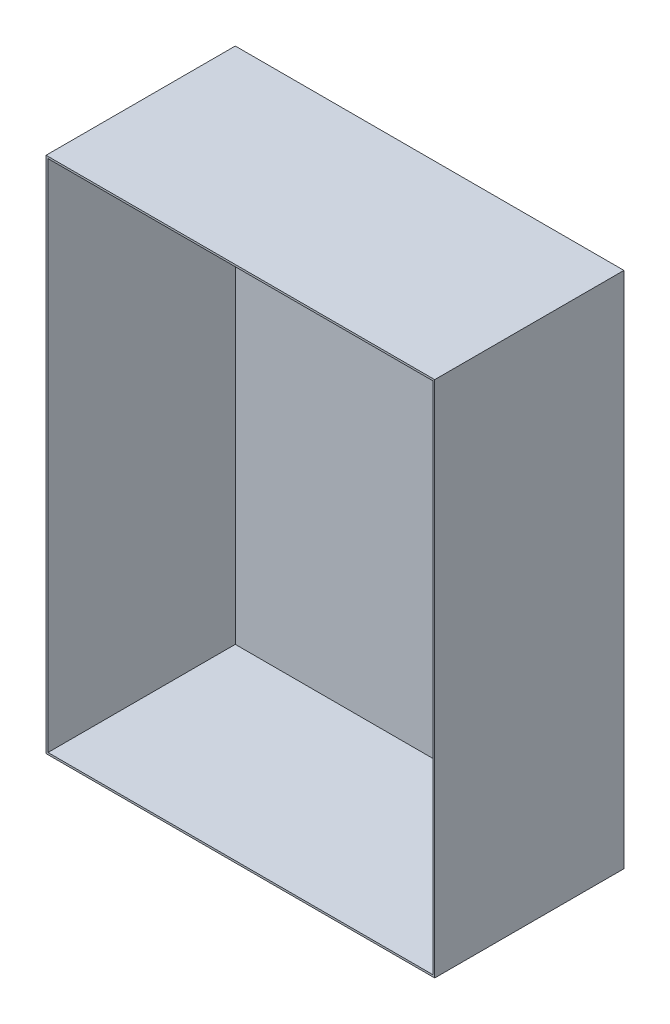
ISO-10303-21;
HEADER;
FILE_DESCRIPTION(('STEP AP214'),'2;1');
FILE_NAME('part.step','',(''),(''),'','','');
FILE_SCHEMA(('AUTOMOTIVE_DESIGN { 1 0 10303 214 1 1 1 1 }'));
ENDSEC;
DATA;
#1=APPLICATION_CONTEXT('core data for automotive mechanical design processes');
#2=APPLICATION_PROTOCOL_DEFINITION('international standard','automotive_design',2000,#1);
#3=PRODUCT_CONTEXT('',#1,'mechanical');
#4=PRODUCT('Part','Part','',(#3));
#5=PRODUCT_RELATED_PRODUCT_CATEGORY('part','',(#4));
#6=PRODUCT_DEFINITION_FORMATION('','',#4);
#7=PRODUCT_DEFINITION_CONTEXT('part definition',#1,'design');
#8=PRODUCT_DEFINITION('design','',#6,#7);
#9=PRODUCT_DEFINITION_SHAPE('','',#8);
#10=(LENGTH_UNIT() NAMED_UNIT(*) SI_UNIT(.MILLI.,.METRE.));
#11=(NAMED_UNIT(*) PLANE_ANGLE_UNIT() SI_UNIT($,.RADIAN.));
#12=(NAMED_UNIT(*) SI_UNIT($,.STERADIAN.) SOLID_ANGLE_UNIT());
#13=UNCERTAINTY_MEASURE_WITH_UNIT(LENGTH_MEASURE(1.E-05),#10,'distance_accuracy_value','');
#14=(GEOMETRIC_REPRESENTATION_CONTEXT(3) GLOBAL_UNCERTAINTY_ASSIGNED_CONTEXT((#13)) GLOBAL_UNIT_ASSIGNED_CONTEXT((#10,
#11,#12)) REPRESENTATION_CONTEXT('',''));
#15=CARTESIAN_POINT('',(0.,0.,0.));
#16=DIRECTION('',(0.,0.,1.));
#17=DIRECTION('',(1.,0.,0.));
#18=AXIS2_PLACEMENT_3D('',#15,#16,#17);
#19=CARTESIAN_POINT('',(0.,0.,146.05));
#20=DIRECTION('',(0.,0.,-1.));
#21=DIRECTION('',(-1.,0.,0.));
#22=AXIS2_PLACEMENT_3D('',#19,#20,#21);
#23=PLANE('',#22);
#24=DIRECTION('',(0.,1.,0.));
#25=VECTOR('',#24,1.);
#26=CARTESIAN_POINT('',(150.,-200.,146.05));
#27=LINE('',#26,#25);
#28=CARTESIAN_POINT('',(150.,-200.,146.05));
#29=VERTEX_POINT('',#28);
#30=CARTESIAN_POINT('',(150.,200.,146.05));
#31=VERTEX_POINT('',#30);
#32=EDGE_CURVE('E146',#29,#31,#27,.T.);
#33=ORIENTED_EDGE('',*,*,#32,.T.);
#34=DIRECTION('',(-1.,0.,0.));
#35=VECTOR('',#34,1.);
#36=CARTESIAN_POINT('',(-150.,200.,146.05));
#37=LINE('',#36,#35);
#38=CARTESIAN_POINT('',(-150.,200.,146.05));
#39=VERTEX_POINT('',#38);
#40=EDGE_CURVE('E90',#31,#39,#37,.T.);
#41=ORIENTED_EDGE('',*,*,#40,.T.);
#42=DIRECTION('',(0.,-1.,0.));
#43=VECTOR('',#42,1.);
#44=CARTESIAN_POINT('',(-150.,-200.,146.05));
#45=LINE('',#44,#43);
#46=CARTESIAN_POINT('',(-150.,-200.,146.05));
#47=VERTEX_POINT('',#46);
#48=EDGE_CURVE('E149',#39,#47,#45,.T.);
#49=ORIENTED_EDGE('',*,*,#48,.T.);
#50=DIRECTION('',(1.,0.,0.));
#51=VECTOR('',#50,1.);
#52=CARTESIAN_POINT('',(-150.,-200.,146.05));
#53=LINE('',#52,#51);
#54=EDGE_CURVE('E62',#47,#29,#53,.T.);
#55=ORIENTED_EDGE('',*,*,#54,.T.);
#56=EDGE_LOOP('',(#33,#41,#49,#55));
#57=FACE_BOUND('',#56,.T.);
#58=DIRECTION('',(0.,1.,0.));
#59=VECTOR('',#58,1.);
#60=CARTESIAN_POINT('',(148.499999952,0.,146.05));
#61=LINE('',#60,#59);
#62=CARTESIAN_POINT('',(148.499999952,-198.499999952,146.05));
#63=VERTEX_POINT('',#62);
#64=CARTESIAN_POINT('',(148.499999952,198.499999952,146.05));
#65=VERTEX_POINT('',#64);
#66=EDGE_CURVE('E135',#63,#65,#61,.T.);
#67=ORIENTED_EDGE('',*,*,#66,.F.);
#68=DIRECTION('',(1.,0.,0.));
#69=VECTOR('',#68,1.);
#70=CARTESIAN_POINT('',(0.,-198.499999952,146.05));
#71=LINE('',#70,#69);
#72=CARTESIAN_POINT('',(-148.499999952,-198.499999952,146.05));
#73=VERTEX_POINT('',#72);
#74=EDGE_CURVE('E144',#73,#63,#71,.T.);
#75=ORIENTED_EDGE('',*,*,#74,.F.);
#76=DIRECTION('',(0.,-1.,0.));
#77=VECTOR('',#76,1.);
#78=CARTESIAN_POINT('',(-148.499999952,0.,146.05));
#79=LINE('',#78,#77);
#80=CARTESIAN_POINT('',(-148.499999952,198.499999952,146.05));
#81=VERTEX_POINT('',#80);
#82=EDGE_CURVE('E142',#81,#73,#79,.T.);
#83=ORIENTED_EDGE('',*,*,#82,.F.);
#84=DIRECTION('',(-1.,0.,0.));
#85=VECTOR('',#84,1.);
#86=CARTESIAN_POINT('',(0.,198.499999952,146.05));
#87=LINE('',#86,#85);
#88=EDGE_CURVE('E127',#65,#81,#87,.T.);
#89=ORIENTED_EDGE('',*,*,#88,.F.);
#90=EDGE_LOOP('',(#67,#75,#83,#89));
#91=FACE_BOUND('',#90,.T.);
#92=ADVANCED_FACE('F38',(#57,#91),#23,.F.);
#93=CARTESIAN_POINT('',(150.,-200.,146.05));
#94=DIRECTION('',(-1.,0.,0.));
#95=DIRECTION('',(0.,0.,1.));
#96=AXIS2_PLACEMENT_3D('',#93,#94,#95);
#97=PLANE('',#96);
#98=DIRECTION('',(0.,1.,0.));
#99=VECTOR('',#98,1.);
#100=CARTESIAN_POINT('',(150.,-200.,0.));
#101=LINE('',#100,#99);
#102=CARTESIAN_POINT('',(150.,-200.,0.));
#103=VERTEX_POINT('',#102);
#104=CARTESIAN_POINT('',(150.,200.,0.));
#105=VERTEX_POINT('',#104);
#106=EDGE_CURVE('E153',#103,#105,#101,.T.);
#107=ORIENTED_EDGE('',*,*,#106,.T.);
#108=DIRECTION('',(0.,0.,-1.));
#109=VECTOR('',#108,1.);
#110=CARTESIAN_POINT('',(150.,200.,146.05));
#111=LINE('',#110,#109);
#112=EDGE_CURVE('E11',#31,#105,#111,.T.);
#113=ORIENTED_EDGE('',*,*,#112,.F.);
#114=ORIENTED_EDGE('',*,*,#32,.F.);
#115=DIRECTION('',(0.,0.,-1.));
#116=VECTOR('',#115,1.);
#117=CARTESIAN_POINT('',(150.,-200.,146.05));
#118=LINE('',#117,#116);
#119=EDGE_CURVE('E152',#29,#103,#118,.T.);
#120=ORIENTED_EDGE('',*,*,#119,.T.);
#121=EDGE_LOOP('',(#107,#113,#114,#120));
#122=FACE_BOUND('',#121,.T.);
#123=ADVANCED_FACE('F40',(#122),#97,.F.);
#124=CARTESIAN_POINT('',(-150.,200.,146.05));
#125=DIRECTION('',(0.,-1.,0.));
#126=DIRECTION('',(0.,0.,-1.));
#127=AXIS2_PLACEMENT_3D('',#124,#125,#126);
#128=PLANE('',#127);
#129=DIRECTION('',(-1.,0.,0.));
#130=VECTOR('',#129,1.);
#131=CARTESIAN_POINT('',(-150.,200.,0.));
#132=LINE('',#131,#130);
#133=CARTESIAN_POINT('',(-150.,200.,0.));
#134=VERTEX_POINT('',#133);
#135=EDGE_CURVE('E156',#105,#134,#132,.T.);
#136=ORIENTED_EDGE('',*,*,#135,.T.);
#137=DIRECTION('',(0.,0.,-1.));
#138=VECTOR('',#137,1.);
#139=CARTESIAN_POINT('',(-150.,200.,146.05));
#140=LINE('',#139,#138);
#141=EDGE_CURVE('E46',#39,#134,#140,.T.);
#142=ORIENTED_EDGE('',*,*,#141,.F.);
#143=ORIENTED_EDGE('',*,*,#40,.F.);
#144=ORIENTED_EDGE('',*,*,#112,.T.);
#145=EDGE_LOOP('',(#136,#142,#143,#144));
#146=FACE_BOUND('',#145,.T.);
#147=ADVANCED_FACE('F184',(#146),#128,.F.);
#148=CARTESIAN_POINT('',(-150.,-200.,146.05));
#149=DIRECTION('',(1.,0.,0.));
#150=DIRECTION('',(0.,0.,-1.));
#151=AXIS2_PLACEMENT_3D('',#148,#149,#150);
#152=PLANE('',#151);
#153=DIRECTION('',(0.,-1.,0.));
#154=VECTOR('',#153,1.);
#155=CARTESIAN_POINT('',(-150.,-200.,0.));
#156=LINE('',#155,#154);
#157=CARTESIAN_POINT('',(-150.,-200.,0.));
#158=VERTEX_POINT('',#157);
#159=EDGE_CURVE('E158',#134,#158,#156,.T.);
#160=ORIENTED_EDGE('',*,*,#159,.T.);
#161=DIRECTION('',(0.,0.,-1.));
#162=VECTOR('',#161,1.);
#163=CARTESIAN_POINT('',(-150.,-200.,146.05));
#164=LINE('',#163,#162);
#165=EDGE_CURVE('E162',#47,#158,#164,.T.);
#166=ORIENTED_EDGE('',*,*,#165,.F.);
#167=ORIENTED_EDGE('',*,*,#48,.F.);
#168=ORIENTED_EDGE('',*,*,#141,.T.);
#169=EDGE_LOOP('',(#160,#166,#167,#168));
#170=FACE_BOUND('',#169,.T.);
#171=ADVANCED_FACE('F167',(#170),#152,.F.);
#172=CARTESIAN_POINT('',(-150.,-200.,146.05));
#173=DIRECTION('',(0.,1.,0.));
#174=DIRECTION('',(0.,0.,1.));
#175=AXIS2_PLACEMENT_3D('',#172,#173,#174);
#176=PLANE('',#175);
#177=DIRECTION('',(1.,0.,0.));
#178=VECTOR('',#177,1.);
#179=CARTESIAN_POINT('',(-150.,-200.,0.));
#180=LINE('',#179,#178);
#181=EDGE_CURVE('E83',#158,#103,#180,.T.);
#182=ORIENTED_EDGE('',*,*,#181,.T.);
#183=ORIENTED_EDGE('',*,*,#119,.F.);
#184=ORIENTED_EDGE('',*,*,#54,.F.);
#185=ORIENTED_EDGE('',*,*,#165,.T.);
#186=EDGE_LOOP('',(#182,#183,#184,#185));
#187=FACE_BOUND('',#186,.T.);
#188=ADVANCED_FACE('F175',(#187),#176,.F.);
#189=CARTESIAN_POINT('',(0.,0.,0.));
#190=DIRECTION('',(0.,0.,-1.));
#191=DIRECTION('',(-1.,0.,0.));
#192=AXIS2_PLACEMENT_3D('',#189,#190,#191);
#193=PLANE('',#192);
#194=ORIENTED_EDGE('',*,*,#106,.F.);
#195=ORIENTED_EDGE('',*,*,#181,.F.);
#196=ORIENTED_EDGE('',*,*,#159,.F.);
#197=ORIENTED_EDGE('',*,*,#135,.F.);
#198=EDGE_LOOP('',(#194,#195,#196,#197));
#199=FACE_BOUND('',#198,.T.);
#200=ADVANCED_FACE('F171',(#199),#193,.T.);
#201=CARTESIAN_POINT('',(148.499999952,-200.,146.05));
#202=DIRECTION('',(-1.,0.,0.));
#203=DIRECTION('',(0.,0.,1.));
#204=AXIS2_PLACEMENT_3D('',#201,#202,#203);
#205=PLANE('',#204);
#206=DIRECTION('',(0.,1.,0.));
#207=VECTOR('',#206,1.);
#208=CARTESIAN_POINT('',(148.499999952,0.,1.500000048));
#209=LINE('',#208,#207);
#210=CARTESIAN_POINT('',(148.499999952,-198.499999952,1.500000048));
#211=VERTEX_POINT('',#210);
#212=CARTESIAN_POINT('',(148.499999952,198.499999952,1.500000048));
#213=VERTEX_POINT('',#212);
#214=EDGE_CURVE('E118',#211,#213,#209,.T.);
#215=ORIENTED_EDGE('',*,*,#214,.F.);
#216=DIRECTION('',(0.,0.,-1.));
#217=VECTOR('',#216,1.);
#218=CARTESIAN_POINT('',(148.499999952,-198.499999952,146.05));
#219=LINE('',#218,#217);
#220=EDGE_CURVE('E138',#63,#211,#219,.T.);
#221=ORIENTED_EDGE('',*,*,#220,.F.);
#222=ORIENTED_EDGE('',*,*,#66,.T.);
#223=DIRECTION('',(0.,0.,-1.));
#224=VECTOR('',#223,1.);
#225=CARTESIAN_POINT('',(148.499999952,198.499999952,146.05));
#226=LINE('',#225,#224);
#227=EDGE_CURVE('E130',#65,#213,#226,.T.);
#228=ORIENTED_EDGE('',*,*,#227,.T.);
#229=EDGE_LOOP('',(#215,#221,#222,#228));
#230=FACE_BOUND('',#229,.T.);
#231=ADVANCED_FACE('F182',(#230),#205,.T.);
#232=CARTESIAN_POINT('',(-150.,198.499999952,146.05));
#233=DIRECTION('',(0.,-1.,0.));
#234=DIRECTION('',(0.,0.,-1.));
#235=AXIS2_PLACEMENT_3D('',#232,#233,#234);
#236=PLANE('',#235);
#237=DIRECTION('',(-1.,0.,0.));
#238=VECTOR('',#237,1.);
#239=CARTESIAN_POINT('',(0.,198.499999952,1.500000048));
#240=LINE('',#239,#238);
#241=CARTESIAN_POINT('',(-148.499999952,198.499999952,1.500000048));
#242=VERTEX_POINT('',#241);
#243=EDGE_CURVE('E112',#213,#242,#240,.T.);
#244=ORIENTED_EDGE('',*,*,#243,.F.);
#245=ORIENTED_EDGE('',*,*,#227,.F.);
#246=ORIENTED_EDGE('',*,*,#88,.T.);
#247=DIRECTION('',(0.,0.,-1.));
#248=VECTOR('',#247,1.);
#249=CARTESIAN_POINT('',(-148.499999952,198.499999952,146.05));
#250=LINE('',#249,#248);
#251=EDGE_CURVE('E124',#81,#242,#250,.T.);
#252=ORIENTED_EDGE('',*,*,#251,.T.);
#253=EDGE_LOOP('',(#244,#245,#246,#252));
#254=FACE_BOUND('',#253,.T.);
#255=ADVANCED_FACE('F125',(#254),#236,.T.);
#256=CARTESIAN_POINT('',(-148.499999952,-200.,146.05));
#257=DIRECTION('',(1.,0.,0.));
#258=DIRECTION('',(0.,0.,-1.));
#259=AXIS2_PLACEMENT_3D('',#256,#257,#258);
#260=PLANE('',#259);
#261=DIRECTION('',(0.,-1.,0.));
#262=VECTOR('',#261,1.);
#263=CARTESIAN_POINT('',(-148.499999952,0.,1.500000048));
#264=LINE('',#263,#262);
#265=CARTESIAN_POINT('',(-148.499999952,-198.499999952,1.500000048));
#266=VERTEX_POINT('',#265);
#267=EDGE_CURVE('E116',#242,#266,#264,.T.);
#268=ORIENTED_EDGE('',*,*,#267,.F.);
#269=ORIENTED_EDGE('',*,*,#251,.F.);
#270=ORIENTED_EDGE('',*,*,#82,.T.);
#271=DIRECTION('',(0.,0.,-1.));
#272=VECTOR('',#271,1.);
#273=CARTESIAN_POINT('',(-148.499999952,-198.499999952,146.05));
#274=LINE('',#273,#272);
#275=EDGE_CURVE('E53',#73,#266,#274,.T.);
#276=ORIENTED_EDGE('',*,*,#275,.T.);
#277=EDGE_LOOP('',(#268,#269,#270,#276));
#278=FACE_BOUND('',#277,.T.);
#279=ADVANCED_FACE('F132',(#278),#260,.T.);
#280=CARTESIAN_POINT('',(-150.,-198.499999952,146.05));
#281=DIRECTION('',(0.,1.,0.));
#282=DIRECTION('',(0.,0.,1.));
#283=AXIS2_PLACEMENT_3D('',#280,#281,#282);
#284=PLANE('',#283);
#285=DIRECTION('',(1.,0.,0.));
#286=VECTOR('',#285,1.);
#287=CARTESIAN_POINT('',(0.,-198.499999952,1.500000048));
#288=LINE('',#287,#286);
#289=EDGE_CURVE('E133',#266,#211,#288,.T.);
#290=ORIENTED_EDGE('',*,*,#289,.F.);
#291=ORIENTED_EDGE('',*,*,#275,.F.);
#292=ORIENTED_EDGE('',*,*,#74,.T.);
#293=ORIENTED_EDGE('',*,*,#220,.T.);
#294=EDGE_LOOP('',(#290,#291,#292,#293));
#295=FACE_BOUND('',#294,.T.);
#296=ADVANCED_FACE('F195',(#295),#284,.T.);
#297=CARTESIAN_POINT('',(0.,0.,1.500000048));
#298=DIRECTION('',(0.,0.,-1.));
#299=DIRECTION('',(-1.,0.,0.));
#300=AXIS2_PLACEMENT_3D('',#297,#298,#299);
#301=PLANE('',#300);
#302=ORIENTED_EDGE('',*,*,#214,.T.);
#303=ORIENTED_EDGE('',*,*,#243,.T.);
#304=ORIENTED_EDGE('',*,*,#267,.T.);
#305=ORIENTED_EDGE('',*,*,#289,.T.);
#306=EDGE_LOOP('',(#302,#303,#304,#305));
#307=FACE_BOUND('',#306,.T.);
#308=ADVANCED_FACE('F114',(#307),#301,.F.);
#309=CLOSED_SHELL('',(#92,#123,#147,#171,#188,#200,#231,#255,#279,#296,#308));
#310=MANIFOLD_SOLID_BREP('B2',#309);
#311=ADVANCED_BREP_SHAPE_REPRESENTATION('',(#18,#310),#14);
#312=SHAPE_DEFINITION_REPRESENTATION(#9,#311);
ENDSEC;
END-ISO-10303-21;
